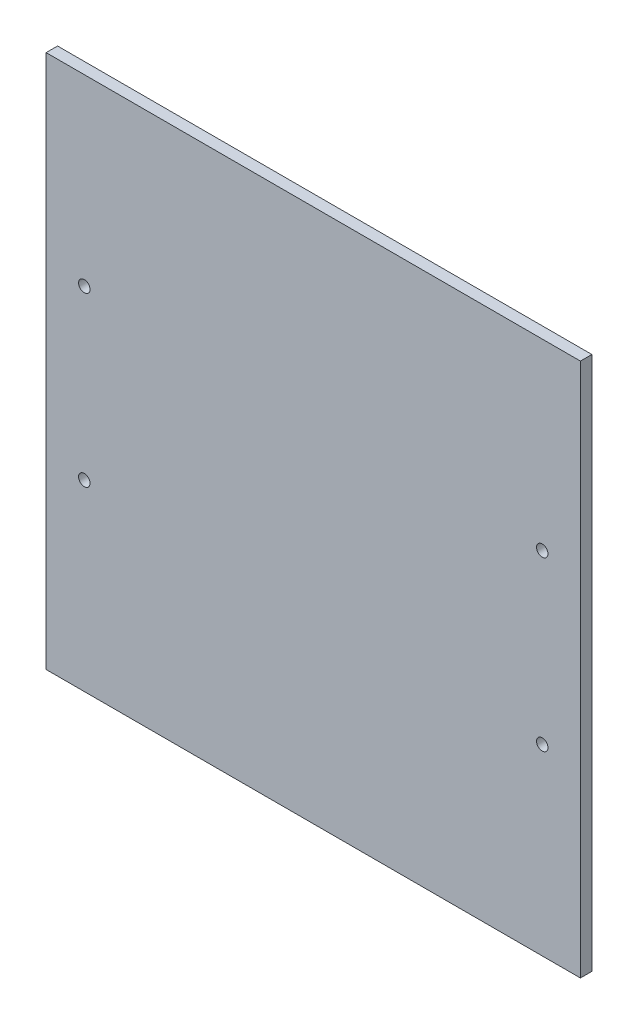
ISO-10303-21;
HEADER;
FILE_DESCRIPTION(('STEP AP214'),'2;1');
FILE_NAME('part.step','',(''),(''),'','','');
FILE_SCHEMA(('AUTOMOTIVE_DESIGN { 1 0 10303 214 1 1 1 1 }'));
ENDSEC;
DATA;
#1=APPLICATION_CONTEXT('core data for automotive mechanical design processes');
#2=APPLICATION_PROTOCOL_DEFINITION('international standard','automotive_design',2000,#1);
#3=PRODUCT_CONTEXT('',#1,'mechanical');
#4=PRODUCT('Part','Part','',(#3));
#5=PRODUCT_RELATED_PRODUCT_CATEGORY('part','',(#4));
#6=PRODUCT_DEFINITION_FORMATION('','',#4);
#7=PRODUCT_DEFINITION_CONTEXT('part definition',#1,'design');
#8=PRODUCT_DEFINITION('design','',#6,#7);
#9=PRODUCT_DEFINITION_SHAPE('','',#8);
#10=(LENGTH_UNIT() NAMED_UNIT(*) SI_UNIT(.MILLI.,.METRE.));
#11=(NAMED_UNIT(*) PLANE_ANGLE_UNIT() SI_UNIT($,.RADIAN.));
#12=(NAMED_UNIT(*) SI_UNIT($,.STERADIAN.) SOLID_ANGLE_UNIT());
#13=UNCERTAINTY_MEASURE_WITH_UNIT(LENGTH_MEASURE(1.E-05),#10,'distance_accuracy_value','');
#14=(GEOMETRIC_REPRESENTATION_CONTEXT(3) GLOBAL_UNCERTAINTY_ASSIGNED_CONTEXT((#13)) GLOBAL_UNIT_ASSIGNED_CONTEXT((#10,
#11,#12)) REPRESENTATION_CONTEXT('',''));
#15=CARTESIAN_POINT('',(0.,0.,0.));
#16=DIRECTION('',(0.,0.,1.));
#17=DIRECTION('',(1.,0.,0.));
#18=AXIS2_PLACEMENT_3D('',#15,#16,#17);
#19=CARTESIAN_POINT('',(0.,0.,3.));
#20=DIRECTION('',(1.,0.,0.));
#21=DIRECTION('',(0.,0.,-1.));
#22=AXIS2_PLACEMENT_3D('',#19,#20,#21);
#23=PLANE('',#22);
#24=DIRECTION('',(0.,-1.,0.));
#25=VECTOR('',#24,1.);
#26=CARTESIAN_POINT('',(0.,0.,0.));
#27=LINE('',#26,#25);
#28=CARTESIAN_POINT('',(0.,140.,0.));
#29=VERTEX_POINT('',#28);
#30=CARTESIAN_POINT('',(0.,0.,0.));
#31=VERTEX_POINT('',#30);
#32=EDGE_CURVE('E95',#29,#31,#27,.T.);
#33=ORIENTED_EDGE('',*,*,#32,.T.);
#34=DIRECTION('',(0.,0.,-1.));
#35=VECTOR('',#34,1.);
#36=CARTESIAN_POINT('',(0.,0.,3.));
#37=LINE('',#36,#35);
#38=CARTESIAN_POINT('',(0.,0.,3.));
#39=VERTEX_POINT('',#38);
#40=EDGE_CURVE('E11',#39,#31,#37,.T.);
#41=ORIENTED_EDGE('',*,*,#40,.F.);
#42=DIRECTION('',(0.,-1.,0.));
#43=VECTOR('',#42,1.);
#44=CARTESIAN_POINT('',(0.,0.,3.));
#45=LINE('',#44,#43);
#46=CARTESIAN_POINT('',(0.,140.,3.));
#47=VERTEX_POINT('',#46);
#48=EDGE_CURVE('E83',#47,#39,#45,.T.);
#49=ORIENTED_EDGE('',*,*,#48,.F.);
#50=DIRECTION('',(0.,0.,-1.));
#51=VECTOR('',#50,1.);
#52=CARTESIAN_POINT('',(0.,140.,3.));
#53=LINE('',#52,#51);
#54=EDGE_CURVE('E91',#47,#29,#53,.T.);
#55=ORIENTED_EDGE('',*,*,#54,.T.);
#56=EDGE_LOOP('',(#33,#41,#49,#55));
#57=FACE_BOUND('',#56,.T.);
#58=ADVANCED_FACE('F32',(#57),#23,.F.);
#59=CARTESIAN_POINT('',(0.,0.,3.));
#60=DIRECTION('',(0.,1.,0.));
#61=DIRECTION('',(-1.,0.,0.));
#62=AXIS2_PLACEMENT_3D('',#59,#60,#61);
#63=PLANE('',#62);
#64=DIRECTION('',(1.,0.,0.));
#65=VECTOR('',#64,1.);
#66=CARTESIAN_POINT('',(0.,0.,0.));
#67=LINE('',#66,#65);
#68=CARTESIAN_POINT('',(140.,0.,0.));
#69=VERTEX_POINT('',#68);
#70=EDGE_CURVE('E87',#31,#69,#67,.T.);
#71=ORIENTED_EDGE('',*,*,#70,.T.);
#72=DIRECTION('',(0.,0.,-1.));
#73=VECTOR('',#72,1.);
#74=CARTESIAN_POINT('',(140.,0.,3.));
#75=LINE('',#74,#73);
#76=CARTESIAN_POINT('',(140.,0.,3.));
#77=VERTEX_POINT('',#76);
#78=EDGE_CURVE('E40',#77,#69,#75,.T.);
#79=ORIENTED_EDGE('',*,*,#78,.F.);
#80=DIRECTION('',(1.,0.,0.));
#81=VECTOR('',#80,1.);
#82=CARTESIAN_POINT('',(0.,0.,3.));
#83=LINE('',#82,#81);
#84=EDGE_CURVE('E78',#39,#77,#83,.T.);
#85=ORIENTED_EDGE('',*,*,#84,.F.);
#86=ORIENTED_EDGE('',*,*,#40,.T.);
#87=EDGE_LOOP('',(#71,#79,#85,#86));
#88=FACE_BOUND('',#87,.T.);
#89=ADVANCED_FACE('F86',(#88),#63,.F.);
#90=CARTESIAN_POINT('',(140.,0.,3.));
#91=DIRECTION('',(-1.,0.,0.));
#92=DIRECTION('',(0.,-1.,0.));
#93=AXIS2_PLACEMENT_3D('',#90,#91,#92);
#94=PLANE('',#93);
#95=DIRECTION('',(0.,1.,0.));
#96=VECTOR('',#95,1.);
#97=CARTESIAN_POINT('',(140.,0.,0.));
#98=LINE('',#97,#96);
#99=CARTESIAN_POINT('',(140.,140.,0.));
#100=VERTEX_POINT('',#99);
#101=EDGE_CURVE('E65',#69,#100,#98,.T.);
#102=ORIENTED_EDGE('',*,*,#101,.T.);
#103=DIRECTION('',(0.,0.,-1.));
#104=VECTOR('',#103,1.);
#105=CARTESIAN_POINT('',(140.,140.,3.));
#106=LINE('',#105,#104);
#107=CARTESIAN_POINT('',(140.,140.,3.));
#108=VERTEX_POINT('',#107);
#109=EDGE_CURVE('E88',#108,#100,#106,.T.);
#110=ORIENTED_EDGE('',*,*,#109,.F.);
#111=DIRECTION('',(0.,1.,0.));
#112=VECTOR('',#111,1.);
#113=CARTESIAN_POINT('',(140.,0.,3.));
#114=LINE('',#113,#112);
#115=EDGE_CURVE('E81',#77,#108,#114,.T.);
#116=ORIENTED_EDGE('',*,*,#115,.F.);
#117=ORIENTED_EDGE('',*,*,#78,.T.);
#118=EDGE_LOOP('',(#102,#110,#116,#117));
#119=FACE_BOUND('',#118,.T.);
#120=ADVANCED_FACE('F89',(#119),#94,.F.);
#121=CARTESIAN_POINT('',(0.,140.,3.));
#122=DIRECTION('',(0.,-1.,0.));
#123=DIRECTION('',(0.,0.,-1.));
#124=AXIS2_PLACEMENT_3D('',#121,#122,#123);
#125=PLANE('',#124);
#126=DIRECTION('',(-1.,0.,0.));
#127=VECTOR('',#126,1.);
#128=CARTESIAN_POINT('',(0.,140.,0.));
#129=LINE('',#128,#127);
#130=EDGE_CURVE('E71',#100,#29,#129,.T.);
#131=ORIENTED_EDGE('',*,*,#130,.T.);
#132=ORIENTED_EDGE('',*,*,#54,.F.);
#133=DIRECTION('',(-1.,0.,0.));
#134=VECTOR('',#133,1.);
#135=CARTESIAN_POINT('',(0.,140.,3.));
#136=LINE('',#135,#134);
#137=EDGE_CURVE('E48',#108,#47,#136,.T.);
#138=ORIENTED_EDGE('',*,*,#137,.F.);
#139=ORIENTED_EDGE('',*,*,#109,.T.);
#140=EDGE_LOOP('',(#131,#132,#138,#139));
#141=FACE_BOUND('',#140,.T.);
#142=ADVANCED_FACE('F103',(#141),#125,.F.);
#143=CARTESIAN_POINT('',(0.,140.,3.));
#144=DIRECTION('',(0.,0.,-1.));
#145=DIRECTION('',(-1.,0.,0.));
#146=AXIS2_PLACEMENT_3D('',#143,#144,#145);
#147=PLANE('',#146);
#148=CARTESIAN_POINT('',(130.,92.,3.));
#149=DIRECTION('',(0.,0.,-1.));
#150=DIRECTION('',(-1.,0.,0.));
#151=AXIS2_PLACEMENT_3D('',#148,#149,#150);
#152=CIRCLE('',#151,1.5);
#153=CARTESIAN_POINT('',(128.5,92.,3.));
#154=VERTEX_POINT('',#153);
#155=EDGE_CURVE('E126',#154,#154,#152,.T.);
#156=ORIENTED_EDGE('',*,*,#155,.T.);
#157=EDGE_LOOP('',(#156));
#158=FACE_BOUND('',#157,.T.);
#159=CARTESIAN_POINT('',(130.,48.,3.));
#160=DIRECTION('',(0.,0.,-1.));
#161=DIRECTION('',(-1.,0.,0.));
#162=AXIS2_PLACEMENT_3D('',#159,#160,#161);
#163=CIRCLE('',#162,1.5);
#164=CARTESIAN_POINT('',(128.5,48.,3.));
#165=VERTEX_POINT('',#164);
#166=EDGE_CURVE('E120',#165,#165,#163,.T.);
#167=ORIENTED_EDGE('',*,*,#166,.T.);
#168=EDGE_LOOP('',(#167));
#169=FACE_BOUND('',#168,.T.);
#170=CARTESIAN_POINT('',(10.,92.,3.));
#171=DIRECTION('',(0.,0.,-1.));
#172=DIRECTION('',(-1.,0.,0.));
#173=AXIS2_PLACEMENT_3D('',#170,#171,#172);
#174=CIRCLE('',#173,1.5);
#175=CARTESIAN_POINT('',(8.50000000000005,92.,3.));
#176=VERTEX_POINT('',#175);
#177=EDGE_CURVE('E114',#176,#176,#174,.T.);
#178=ORIENTED_EDGE('',*,*,#177,.T.);
#179=EDGE_LOOP('',(#178));
#180=FACE_BOUND('',#179,.T.);
#181=CARTESIAN_POINT('',(10.,48.,3.));
#182=DIRECTION('',(0.,0.,-1.));
#183=DIRECTION('',(-1.,0.,0.));
#184=AXIS2_PLACEMENT_3D('',#181,#182,#183);
#185=CIRCLE('',#184,1.5);
#186=CARTESIAN_POINT('',(8.50000000000004,48.,3.));
#187=VERTEX_POINT('',#186);
#188=EDGE_CURVE('E98',#187,#187,#185,.T.);
#189=ORIENTED_EDGE('',*,*,#188,.T.);
#190=EDGE_LOOP('',(#189));
#191=FACE_BOUND('',#190,.T.);
#192=ORIENTED_EDGE('',*,*,#48,.T.);
#193=ORIENTED_EDGE('',*,*,#84,.T.);
#194=ORIENTED_EDGE('',*,*,#115,.T.);
#195=ORIENTED_EDGE('',*,*,#137,.T.);
#196=EDGE_LOOP('',(#192,#193,#194,#195));
#197=FACE_BOUND('',#196,.T.);
#198=ADVANCED_FACE('F79',(#158,#169,#180,#191,#197),#147,.F.);
#199=CARTESIAN_POINT('',(0.,140.,0.));
#200=DIRECTION('',(0.,0.,-1.));
#201=DIRECTION('',(-1.,0.,0.));
#202=AXIS2_PLACEMENT_3D('',#199,#200,#201);
#203=PLANE('',#202);
#204=CARTESIAN_POINT('',(70.,70.,0.));
#205=DIRECTION('',(0.,0.,-1.));
#206=DIRECTION('',(-1.,0.,0.));
#207=AXIS2_PLACEMENT_3D('',#204,#205,#206);
#208=CIRCLE('',#207,3.00000000000001);
#209=CARTESIAN_POINT('',(67.,70.,0.));
#210=VERTEX_POINT('',#209);
#211=EDGE_CURVE('E133',#210,#210,#208,.T.);
#212=ORIENTED_EDGE('',*,*,#211,.F.);
#213=EDGE_LOOP('',(#212));
#214=FACE_BOUND('',#213,.T.);
#215=CARTESIAN_POINT('',(130.,92.,0.));
#216=DIRECTION('',(0.,0.,-1.));
#217=DIRECTION('',(-1.,0.,0.));
#218=AXIS2_PLACEMENT_3D('',#215,#216,#217);
#219=CIRCLE('',#218,1.5);
#220=CARTESIAN_POINT('',(128.5,92.,0.));
#221=VERTEX_POINT('',#220);
#222=EDGE_CURVE('E129',#221,#221,#219,.T.);
#223=ORIENTED_EDGE('',*,*,#222,.F.);
#224=EDGE_LOOP('',(#223));
#225=FACE_BOUND('',#224,.T.);
#226=CARTESIAN_POINT('',(130.,48.,0.));
#227=DIRECTION('',(0.,0.,-1.));
#228=DIRECTION('',(-1.,0.,0.));
#229=AXIS2_PLACEMENT_3D('',#226,#227,#228);
#230=CIRCLE('',#229,1.49999999999997);
#231=CARTESIAN_POINT('',(128.5,48.,0.));
#232=VERTEX_POINT('',#231);
#233=EDGE_CURVE('E123',#232,#232,#230,.T.);
#234=ORIENTED_EDGE('',*,*,#233,.F.);
#235=EDGE_LOOP('',(#234));
#236=FACE_BOUND('',#235,.T.);
#237=CARTESIAN_POINT('',(10.,92.,0.));
#238=DIRECTION('',(0.,0.,-1.));
#239=DIRECTION('',(-1.,0.,0.));
#240=AXIS2_PLACEMENT_3D('',#237,#238,#239);
#241=CIRCLE('',#240,1.49999999999999);
#242=CARTESIAN_POINT('',(8.50000000000006,92.,0.));
#243=VERTEX_POINT('',#242);
#244=EDGE_CURVE('E117',#243,#243,#241,.T.);
#245=ORIENTED_EDGE('',*,*,#244,.F.);
#246=EDGE_LOOP('',(#245));
#247=FACE_BOUND('',#246,.T.);
#248=CARTESIAN_POINT('',(10.,48.,0.));
#249=DIRECTION('',(0.,0.,-1.));
#250=DIRECTION('',(-1.,0.,0.));
#251=AXIS2_PLACEMENT_3D('',#248,#249,#250);
#252=CIRCLE('',#251,1.49999999999999);
#253=CARTESIAN_POINT('',(8.50000000000005,48.,0.));
#254=VERTEX_POINT('',#253);
#255=EDGE_CURVE('E111',#254,#254,#252,.T.);
#256=ORIENTED_EDGE('',*,*,#255,.F.);
#257=EDGE_LOOP('',(#256));
#258=FACE_BOUND('',#257,.T.);
#259=ORIENTED_EDGE('',*,*,#32,.F.);
#260=ORIENTED_EDGE('',*,*,#130,.F.);
#261=ORIENTED_EDGE('',*,*,#101,.F.);
#262=ORIENTED_EDGE('',*,*,#70,.F.);
#263=EDGE_LOOP('',(#259,#260,#261,#262));
#264=FACE_BOUND('',#263,.T.);
#265=ADVANCED_FACE('F106',(#214,#225,#236,#247,#258,#264),#203,.T.);
#266=CARTESIAN_POINT('',(10.,48.,0.));
#267=DIRECTION('',(0.,0.,-1.));
#268=DIRECTION('',(-1.,0.,0.));
#269=AXIS2_PLACEMENT_3D('',#266,#267,#268);
#270=CYLINDRICAL_SURFACE('',#269,1.49999999999999);
#271=ORIENTED_EDGE('',*,*,#188,.F.);
#272=EDGE_LOOP('',(#271));
#273=FACE_BOUND('',#272,.T.);
#274=ORIENTED_EDGE('',*,*,#255,.T.);
#275=EDGE_LOOP('',(#274));
#276=FACE_BOUND('',#275,.T.);
#277=ADVANCED_FACE('F150',(#273,#276),#270,.F.);
#278=CARTESIAN_POINT('',(10.,92.,0.));
#279=DIRECTION('',(0.,0.,-1.));
#280=DIRECTION('',(-1.,0.,0.));
#281=AXIS2_PLACEMENT_3D('',#278,#279,#280);
#282=CYLINDRICAL_SURFACE('',#281,1.49999999999999);
#283=ORIENTED_EDGE('',*,*,#177,.F.);
#284=EDGE_LOOP('',(#283));
#285=FACE_BOUND('',#284,.T.);
#286=ORIENTED_EDGE('',*,*,#244,.T.);
#287=EDGE_LOOP('',(#286));
#288=FACE_BOUND('',#287,.T.);
#289=ADVANCED_FACE('F161',(#285,#288),#282,.F.);
#290=CARTESIAN_POINT('',(130.,48.,0.));
#291=DIRECTION('',(0.,0.,-1.));
#292=DIRECTION('',(-1.,0.,0.));
#293=AXIS2_PLACEMENT_3D('',#290,#291,#292);
#294=CYLINDRICAL_SURFACE('',#293,1.49999999999999);
#295=ORIENTED_EDGE('',*,*,#166,.F.);
#296=EDGE_LOOP('',(#295));
#297=FACE_BOUND('',#296,.T.);
#298=ORIENTED_EDGE('',*,*,#233,.T.);
#299=EDGE_LOOP('',(#298));
#300=FACE_BOUND('',#299,.T.);
#301=ADVANCED_FACE('F167',(#297,#300),#294,.F.);
#302=CARTESIAN_POINT('',(130.,92.,0.));
#303=DIRECTION('',(0.,0.,-1.));
#304=DIRECTION('',(-1.,0.,0.));
#305=AXIS2_PLACEMENT_3D('',#302,#303,#304);
#306=CYLINDRICAL_SURFACE('',#305,1.5);
#307=ORIENTED_EDGE('',*,*,#155,.F.);
#308=EDGE_LOOP('',(#307));
#309=FACE_BOUND('',#308,.T.);
#310=ORIENTED_EDGE('',*,*,#222,.T.);
#311=EDGE_LOOP('',(#310));
#312=FACE_BOUND('',#311,.T.);
#313=ADVANCED_FACE('F144',(#309,#312),#306,.F.);
#314=CARTESIAN_POINT('',(70.,70.,2.));
#315=DIRECTION('',(0.,0.,-1.));
#316=DIRECTION('',(-1.,0.,0.));
#317=AXIS2_PLACEMENT_3D('',#314,#315,#316);
#318=CYLINDRICAL_SURFACE('',#317,3.00000000000001);
#319=CARTESIAN_POINT('',(70.,70.,2.));
#320=DIRECTION('',(0.,0.,-1.));
#321=DIRECTION('',(-1.,0.,0.));
#322=AXIS2_PLACEMENT_3D('',#319,#320,#321);
#323=CIRCLE('',#322,3.00000000000001);
#324=CARTESIAN_POINT('',(67.,70.,2.));
#325=VERTEX_POINT('',#324);
#326=EDGE_CURVE('E132',#325,#325,#323,.T.);
#327=ORIENTED_EDGE('',*,*,#326,.F.);
#328=EDGE_LOOP('',(#327));
#329=FACE_BOUND('',#328,.T.);
#330=ORIENTED_EDGE('',*,*,#211,.T.);
#331=EDGE_LOOP('',(#330));
#332=FACE_BOUND('',#331,.T.);
#333=ADVANCED_FACE('F141',(#329,#332),#318,.F.);
#334=CARTESIAN_POINT('',(70.,70.,2.));
#335=DIRECTION('',(0.,0.,-1.));
#336=DIRECTION('',(-1.,0.,0.));
#337=AXIS2_PLACEMENT_3D('',#334,#335,#336);
#338=PLANE('',#337);
#339=ORIENTED_EDGE('',*,*,#326,.T.);
#340=EDGE_LOOP('',(#339));
#341=FACE_BOUND('',#340,.T.);
#342=ADVANCED_FACE('F139',(#341),#338,.T.);
#343=CLOSED_SHELL('',(#58,#89,#120,#142,#198,#265,#277,#289,#301,#313,#333,#342));
#344=MANIFOLD_SOLID_BREP('B2',#343);
#345=ADVANCED_BREP_SHAPE_REPRESENTATION('',(#18,#344),#14);
#346=SHAPE_DEFINITION_REPRESENTATION(#9,#345);
ENDSEC;
END-ISO-10303-21;
